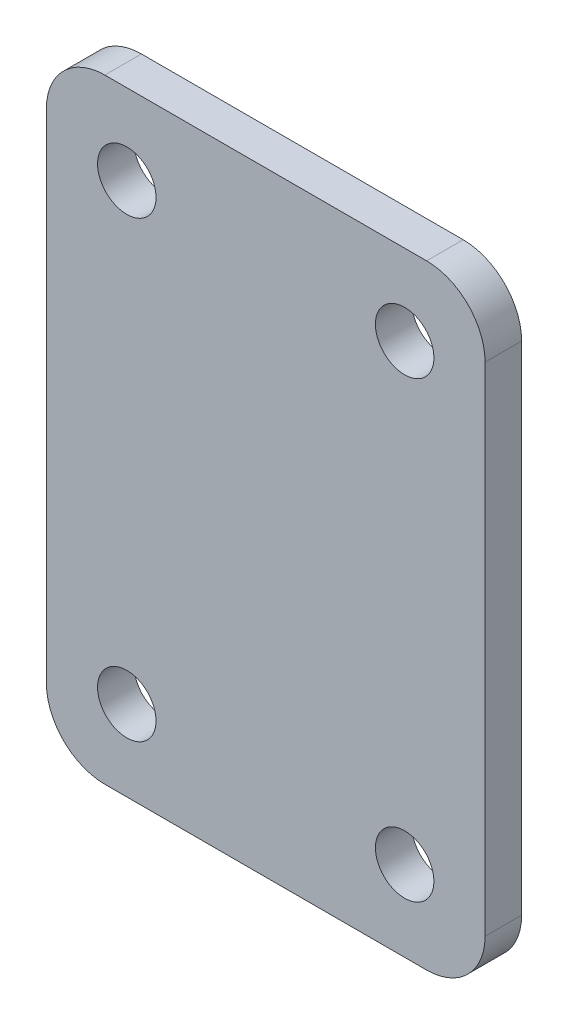
ISO-10303-21;
HEADER;
FILE_DESCRIPTION(('STEP AP214'),'2;1');
FILE_NAME('part.step','',(''),(''),'','','');
FILE_SCHEMA(('AUTOMOTIVE_DESIGN { 1 0 10303 214 1 1 1 1 }'));
ENDSEC;
DATA;
#1=APPLICATION_CONTEXT('core data for automotive mechanical design processes');
#2=APPLICATION_PROTOCOL_DEFINITION('international standard','automotive_design',2000,#1);
#3=PRODUCT_CONTEXT('',#1,'mechanical');
#4=PRODUCT('Part','Part','',(#3));
#5=PRODUCT_RELATED_PRODUCT_CATEGORY('part','',(#4));
#6=PRODUCT_DEFINITION_FORMATION('','',#4);
#7=PRODUCT_DEFINITION_CONTEXT('part definition',#1,'design');
#8=PRODUCT_DEFINITION('design','',#6,#7);
#9=PRODUCT_DEFINITION_SHAPE('','',#8);
#10=(LENGTH_UNIT() NAMED_UNIT(*) SI_UNIT(.MILLI.,.METRE.));
#11=(NAMED_UNIT(*) PLANE_ANGLE_UNIT() SI_UNIT($,.RADIAN.));
#12=(NAMED_UNIT(*) SI_UNIT($,.STERADIAN.) SOLID_ANGLE_UNIT());
#13=UNCERTAINTY_MEASURE_WITH_UNIT(LENGTH_MEASURE(1.E-05),#10,'distance_accuracy_value','');
#14=(GEOMETRIC_REPRESENTATION_CONTEXT(3) GLOBAL_UNCERTAINTY_ASSIGNED_CONTEXT((#13)) GLOBAL_UNIT_ASSIGNED_CONTEXT((#10,
#11,#12)) REPRESENTATION_CONTEXT('',''));
#15=CARTESIAN_POINT('',(0.,0.,0.));
#16=DIRECTION('',(0.,0.,1.));
#17=DIRECTION('',(1.,0.,0.));
#18=AXIS2_PLACEMENT_3D('',#15,#16,#17);
#19=CARTESIAN_POINT('',(71.,-17.,4.88125));
#20=DIRECTION('',(0.,0.,-1.));
#21=DIRECTION('',(-1.,0.,0.));
#22=AXIS2_PLACEMENT_3D('',#19,#20,#21);
#23=PLANE('',#22);
#24=CARTESIAN_POINT('',(71.,-17.,4.88125));
#25=DIRECTION('',(0.,0.,1.));
#26=DIRECTION('',(-1.,0.,0.));
#27=AXIS2_PLACEMENT_3D('',#24,#25,#26);
#28=CIRCLE('',#27,4.);
#29=CARTESIAN_POINT('',(71.,-21.,4.88125));
#30=VERTEX_POINT('',#29);
#31=CARTESIAN_POINT('',(75.,-17.,4.88125));
#32=VERTEX_POINT('',#31);
#33=EDGE_CURVE('E152',#30,#32,#28,.T.);
#34=ORIENTED_EDGE('',*,*,#33,.T.);
#35=DIRECTION('',(0.,1.,0.));
#36=VECTOR('',#35,1.);
#37=CARTESIAN_POINT('',(75.,17.,4.88125));
#38=LINE('',#37,#36);
#39=CARTESIAN_POINT('',(75.,17.,4.88125));
#40=VERTEX_POINT('',#39);
#41=EDGE_CURVE('E100',#32,#40,#38,.T.);
#42=ORIENTED_EDGE('',*,*,#41,.T.);
#43=CARTESIAN_POINT('',(71.,17.,4.88125));
#44=DIRECTION('',(0.,0.,1.));
#45=DIRECTION('',(1.,0.,0.));
#46=AXIS2_PLACEMENT_3D('',#43,#44,#45);
#47=CIRCLE('',#46,4.);
#48=CARTESIAN_POINT('',(71.,21.,4.88125));
#49=VERTEX_POINT('',#48);
#50=EDGE_CURVE('E167',#40,#49,#47,.T.);
#51=ORIENTED_EDGE('',*,*,#50,.T.);
#52=DIRECTION('',(-1.,0.,0.));
#53=VECTOR('',#52,1.);
#54=CARTESIAN_POINT('',(49.,21.,4.88125));
#55=LINE('',#54,#53);
#56=CARTESIAN_POINT('',(49.,21.,4.88125));
#57=VERTEX_POINT('',#56);
#58=EDGE_CURVE('E180',#49,#57,#55,.T.);
#59=ORIENTED_EDGE('',*,*,#58,.T.);
#60=CARTESIAN_POINT('',(49.,17.,4.88125));
#61=DIRECTION('',(0.,0.,1.));
#62=DIRECTION('',(1.,0.,0.));
#63=AXIS2_PLACEMENT_3D('',#60,#61,#62);
#64=CIRCLE('',#63,4.);
#65=CARTESIAN_POINT('',(45.,17.,4.88125));
#66=VERTEX_POINT('',#65);
#67=EDGE_CURVE('E119',#57,#66,#64,.T.);
#68=ORIENTED_EDGE('',*,*,#67,.T.);
#69=DIRECTION('',(0.,-1.,0.));
#70=VECTOR('',#69,1.);
#71=CARTESIAN_POINT('',(45.,17.,4.88125));
#72=LINE('',#71,#70);
#73=CARTESIAN_POINT('',(45.,-17.,4.88125));
#74=VERTEX_POINT('',#73);
#75=EDGE_CURVE('E113',#66,#74,#72,.T.);
#76=ORIENTED_EDGE('',*,*,#75,.T.);
#77=CARTESIAN_POINT('',(49.,-17.,4.88125));
#78=DIRECTION('',(0.,0.,1.));
#79=DIRECTION('',(-1.,0.,0.));
#80=AXIS2_PLACEMENT_3D('',#77,#78,#79);
#81=CIRCLE('',#80,4.);
#82=CARTESIAN_POINT('',(49.,-21.,4.88125));
#83=VERTEX_POINT('',#82);
#84=EDGE_CURVE('E117',#74,#83,#81,.T.);
#85=ORIENTED_EDGE('',*,*,#84,.T.);
#86=DIRECTION('',(1.,0.,0.));
#87=VECTOR('',#86,1.);
#88=CARTESIAN_POINT('',(49.,-21.,4.88125));
#89=LINE('',#88,#87);
#90=EDGE_CURVE('E57',#83,#30,#89,.T.);
#91=ORIENTED_EDGE('',*,*,#90,.T.);
#92=EDGE_LOOP('',(#34,#42,#51,#59,#68,#76,#85,#91));
#93=FACE_BOUND('',#92,.T.);
#94=CARTESIAN_POINT('',(50.5,15.5,4.88125));
#95=DIRECTION('',(0.,0.,1.));
#96=DIRECTION('',(1.,0.,0.));
#97=AXIS2_PLACEMENT_3D('',#94,#95,#96);
#98=CIRCLE('',#97,2.);
#99=CARTESIAN_POINT('',(52.5,15.5,4.88125));
#100=VERTEX_POINT('',#99);
#101=EDGE_CURVE('E141',#100,#100,#98,.T.);
#102=ORIENTED_EDGE('',*,*,#101,.F.);
#103=EDGE_LOOP('',(#102));
#104=FACE_BOUND('',#103,.T.);
#105=CARTESIAN_POINT('',(69.5,15.5,4.88125));
#106=DIRECTION('',(0.,0.,1.));
#107=DIRECTION('',(-1.,0.,0.));
#108=AXIS2_PLACEMENT_3D('',#105,#106,#107);
#109=CIRCLE('',#108,2.00000000000001);
#110=CARTESIAN_POINT('',(67.5,15.5,4.88125));
#111=VERTEX_POINT('',#110);
#112=EDGE_CURVE('E189',#111,#111,#109,.T.);
#113=ORIENTED_EDGE('',*,*,#112,.F.);
#114=EDGE_LOOP('',(#113));
#115=FACE_BOUND('',#114,.T.);
#116=CARTESIAN_POINT('',(69.5,-15.5,4.88125));
#117=DIRECTION('',(0.,0.,1.));
#118=DIRECTION('',(1.,0.,0.));
#119=AXIS2_PLACEMENT_3D('',#116,#117,#118);
#120=CIRCLE('',#119,2.00000000000001);
#121=CARTESIAN_POINT('',(71.5,-15.5,4.88125));
#122=VERTEX_POINT('',#121);
#123=EDGE_CURVE('E195',#122,#122,#120,.T.);
#124=ORIENTED_EDGE('',*,*,#123,.F.);
#125=EDGE_LOOP('',(#124));
#126=FACE_BOUND('',#125,.T.);
#127=CARTESIAN_POINT('',(50.5,-15.5,4.88125));
#128=DIRECTION('',(0.,0.,1.));
#129=DIRECTION('',(-1.,0.,0.));
#130=AXIS2_PLACEMENT_3D('',#127,#128,#129);
#131=CIRCLE('',#130,2.);
#132=CARTESIAN_POINT('',(48.5,-15.5,4.88125));
#133=VERTEX_POINT('',#132);
#134=EDGE_CURVE('E201',#133,#133,#131,.T.);
#135=ORIENTED_EDGE('',*,*,#134,.F.);
#136=EDGE_LOOP('',(#135));
#137=FACE_BOUND('',#136,.T.);
#138=ADVANCED_FACE('F40',(#93,#104,#115,#126,#137),#23,.F.);
#139=CARTESIAN_POINT('',(71.,-17.,2.38125));
#140=DIRECTION('',(0.,0.,-1.));
#141=DIRECTION('',(-1.,0.,0.));
#142=AXIS2_PLACEMENT_3D('',#139,#140,#141);
#143=PLANE('',#142);
#144=CARTESIAN_POINT('',(69.5,-15.5,2.38125));
#145=DIRECTION('',(0.,0.,1.));
#146=DIRECTION('',(1.,0.,0.));
#147=AXIS2_PLACEMENT_3D('',#144,#145,#146);
#148=CIRCLE('',#147,2.00000000000001);
#149=CARTESIAN_POINT('',(71.5,-15.5,2.38125));
#150=VERTEX_POINT('',#149);
#151=EDGE_CURVE('E198',#150,#150,#148,.T.);
#152=ORIENTED_EDGE('',*,*,#151,.T.);
#153=EDGE_LOOP('',(#152));
#154=FACE_BOUND('',#153,.T.);
#155=CARTESIAN_POINT('',(50.5,15.5,2.38125));
#156=DIRECTION('',(0.,0.,1.));
#157=DIRECTION('',(1.,0.,0.));
#158=AXIS2_PLACEMENT_3D('',#155,#156,#157);
#159=CIRCLE('',#158,2.);
#160=CARTESIAN_POINT('',(52.5,15.5,2.38125));
#161=VERTEX_POINT('',#160);
#162=EDGE_CURVE('E186',#161,#161,#159,.T.);
#163=ORIENTED_EDGE('',*,*,#162,.T.);
#164=EDGE_LOOP('',(#163));
#165=FACE_BOUND('',#164,.T.);
#166=CARTESIAN_POINT('',(71.,-17.,2.38125));
#167=DIRECTION('',(0.,0.,1.));
#168=DIRECTION('',(-1.,0.,0.));
#169=AXIS2_PLACEMENT_3D('',#166,#167,#168);
#170=CIRCLE('',#169,4.);
#171=CARTESIAN_POINT('',(71.,-21.,2.38125));
#172=VERTEX_POINT('',#171);
#173=CARTESIAN_POINT('',(75.,-17.,2.38125));
#174=VERTEX_POINT('',#173);
#175=EDGE_CURVE('E137',#172,#174,#170,.T.);
#176=ORIENTED_EDGE('',*,*,#175,.F.);
#177=DIRECTION('',(1.,0.,0.));
#178=VECTOR('',#177,1.);
#179=CARTESIAN_POINT('',(49.,-21.,2.38125));
#180=LINE('',#179,#178);
#181=CARTESIAN_POINT('',(49.,-21.,2.38125));
#182=VERTEX_POINT('',#181);
#183=EDGE_CURVE('E92',#182,#172,#180,.T.);
#184=ORIENTED_EDGE('',*,*,#183,.F.);
#185=CARTESIAN_POINT('',(49.,-17.,2.38125));
#186=DIRECTION('',(0.,0.,1.));
#187=DIRECTION('',(-1.,0.,0.));
#188=AXIS2_PLACEMENT_3D('',#185,#186,#187);
#189=CIRCLE('',#188,4.);
#190=CARTESIAN_POINT('',(45.,-17.,2.38125));
#191=VERTEX_POINT('',#190);
#192=EDGE_CURVE('E86',#191,#182,#189,.T.);
#193=ORIENTED_EDGE('',*,*,#192,.F.);
#194=DIRECTION('',(0.,-1.,0.));
#195=VECTOR('',#194,1.);
#196=CARTESIAN_POINT('',(45.,17.,2.38125));
#197=LINE('',#196,#195);
#198=CARTESIAN_POINT('',(45.,17.,2.38125));
#199=VERTEX_POINT('',#198);
#200=EDGE_CURVE('E127',#199,#191,#197,.T.);
#201=ORIENTED_EDGE('',*,*,#200,.F.);
#202=CARTESIAN_POINT('',(49.,17.,2.38125));
#203=DIRECTION('',(0.,0.,1.));
#204=DIRECTION('',(1.,0.,0.));
#205=AXIS2_PLACEMENT_3D('',#202,#203,#204);
#206=CIRCLE('',#205,4.);
#207=CARTESIAN_POINT('',(49.,21.,2.38125));
#208=VERTEX_POINT('',#207);
#209=EDGE_CURVE('E147',#208,#199,#206,.T.);
#210=ORIENTED_EDGE('',*,*,#209,.F.);
#211=DIRECTION('',(-1.,0.,0.));
#212=VECTOR('',#211,1.);
#213=CARTESIAN_POINT('',(49.,21.,2.38125));
#214=LINE('',#213,#212);
#215=CARTESIAN_POINT('',(71.,21.,2.38125));
#216=VERTEX_POINT('',#215);
#217=EDGE_CURVE('E145',#216,#208,#214,.T.);
#218=ORIENTED_EDGE('',*,*,#217,.F.);
#219=CARTESIAN_POINT('',(71.,17.,2.38125));
#220=DIRECTION('',(0.,0.,1.));
#221=DIRECTION('',(1.,0.,0.));
#222=AXIS2_PLACEMENT_3D('',#219,#220,#221);
#223=CIRCLE('',#222,4.);
#224=CARTESIAN_POINT('',(75.,17.,2.38125));
#225=VERTEX_POINT('',#224);
#226=EDGE_CURVE('E143',#225,#216,#223,.T.);
#227=ORIENTED_EDGE('',*,*,#226,.F.);
#228=DIRECTION('',(0.,1.,0.));
#229=VECTOR('',#228,1.);
#230=CARTESIAN_POINT('',(75.,17.,2.38125));
#231=LINE('',#230,#229);
#232=EDGE_CURVE('E140',#174,#225,#231,.T.);
#233=ORIENTED_EDGE('',*,*,#232,.F.);
#234=EDGE_LOOP('',(#176,#184,#193,#201,#210,#218,#227,#233));
#235=FACE_BOUND('',#234,.T.);
#236=CARTESIAN_POINT('',(69.5,15.5,2.38125));
#237=DIRECTION('',(0.,0.,1.));
#238=DIRECTION('',(-1.,0.,0.));
#239=AXIS2_PLACEMENT_3D('',#236,#237,#238);
#240=CIRCLE('',#239,2.00000000000001);
#241=CARTESIAN_POINT('',(67.5,15.5,2.38125));
#242=VERTEX_POINT('',#241);
#243=EDGE_CURVE('E192',#242,#242,#240,.T.);
#244=ORIENTED_EDGE('',*,*,#243,.T.);
#245=EDGE_LOOP('',(#244));
#246=FACE_BOUND('',#245,.T.);
#247=CARTESIAN_POINT('',(50.5,-15.5,2.38125));
#248=DIRECTION('',(0.,0.,1.));
#249=DIRECTION('',(-1.,0.,0.));
#250=AXIS2_PLACEMENT_3D('',#247,#248,#249);
#251=CIRCLE('',#250,2.);
#252=CARTESIAN_POINT('',(48.5,-15.5,2.38125));
#253=VERTEX_POINT('',#252);
#254=EDGE_CURVE('E204',#253,#253,#251,.T.);
#255=ORIENTED_EDGE('',*,*,#254,.T.);
#256=EDGE_LOOP('',(#255));
#257=FACE_BOUND('',#256,.T.);
#258=ADVANCED_FACE('F171',(#154,#165,#235,#246,#257),#143,.T.);
#259=CARTESIAN_POINT('',(71.,-17.,4.88125));
#260=DIRECTION('',(0.,0.,-1.));
#261=DIRECTION('',(-1.,0.,0.));
#262=AXIS2_PLACEMENT_3D('',#259,#260,#261);
#263=CYLINDRICAL_SURFACE('',#262,4.);
#264=ORIENTED_EDGE('',*,*,#175,.T.);
#265=DIRECTION('',(0.,0.,-1.));
#266=VECTOR('',#265,1.);
#267=CARTESIAN_POINT('',(75.,-17.,4.88125));
#268=LINE('',#267,#266);
#269=EDGE_CURVE('E11',#32,#174,#268,.T.);
#270=ORIENTED_EDGE('',*,*,#269,.F.);
#271=ORIENTED_EDGE('',*,*,#33,.F.);
#272=DIRECTION('',(0.,0.,-1.));
#273=VECTOR('',#272,1.);
#274=CARTESIAN_POINT('',(71.,-21.,4.88125));
#275=LINE('',#274,#273);
#276=EDGE_CURVE('E133',#30,#172,#275,.T.);
#277=ORIENTED_EDGE('',*,*,#276,.T.);
#278=EDGE_LOOP('',(#264,#270,#271,#277));
#279=FACE_BOUND('',#278,.T.);
#280=ADVANCED_FACE('F42',(#279),#263,.T.);
#281=CARTESIAN_POINT('',(75.,17.,4.88125));
#282=DIRECTION('',(-1.,0.,0.));
#283=DIRECTION('',(0.,0.,1.));
#284=AXIS2_PLACEMENT_3D('',#281,#282,#283);
#285=PLANE('',#284);
#286=ORIENTED_EDGE('',*,*,#232,.T.);
#287=DIRECTION('',(0.,0.,-1.));
#288=VECTOR('',#287,1.);
#289=CARTESIAN_POINT('',(75.,17.,4.88125));
#290=LINE('',#289,#288);
#291=EDGE_CURVE('E49',#40,#225,#290,.T.);
#292=ORIENTED_EDGE('',*,*,#291,.F.);
#293=ORIENTED_EDGE('',*,*,#41,.F.);
#294=ORIENTED_EDGE('',*,*,#269,.T.);
#295=EDGE_LOOP('',(#286,#292,#293,#294));
#296=FACE_BOUND('',#295,.T.);
#297=ADVANCED_FACE('F236',(#296),#285,.F.);
#298=CARTESIAN_POINT('',(71.,17.,4.88125));
#299=DIRECTION('',(0.,0.,-1.));
#300=DIRECTION('',(-1.,0.,0.));
#301=AXIS2_PLACEMENT_3D('',#298,#299,#300);
#302=CYLINDRICAL_SURFACE('',#301,4.);
#303=ORIENTED_EDGE('',*,*,#226,.T.);
#304=DIRECTION('',(0.,0.,-1.));
#305=VECTOR('',#304,1.);
#306=CARTESIAN_POINT('',(71.,21.,4.88125));
#307=LINE('',#306,#305);
#308=EDGE_CURVE('E159',#49,#216,#307,.T.);
#309=ORIENTED_EDGE('',*,*,#308,.F.);
#310=ORIENTED_EDGE('',*,*,#50,.F.);
#311=ORIENTED_EDGE('',*,*,#291,.T.);
#312=EDGE_LOOP('',(#303,#309,#310,#311));
#313=FACE_BOUND('',#312,.T.);
#314=ADVANCED_FACE('F165',(#313),#302,.T.);
#315=CARTESIAN_POINT('',(49.,21.,4.88125));
#316=DIRECTION('',(0.,-1.,0.));
#317=DIRECTION('',(0.,0.,-1.));
#318=AXIS2_PLACEMENT_3D('',#315,#316,#317);
#319=PLANE('',#318);
#320=ORIENTED_EDGE('',*,*,#217,.T.);
#321=DIRECTION('',(0.,0.,-1.));
#322=VECTOR('',#321,1.);
#323=CARTESIAN_POINT('',(49.,21.,4.88125));
#324=LINE('',#323,#322);
#325=EDGE_CURVE('E156',#57,#208,#324,.T.);
#326=ORIENTED_EDGE('',*,*,#325,.F.);
#327=ORIENTED_EDGE('',*,*,#58,.F.);
#328=ORIENTED_EDGE('',*,*,#308,.T.);
#329=EDGE_LOOP('',(#320,#326,#327,#328));
#330=FACE_BOUND('',#329,.T.);
#331=ADVANCED_FACE('F176',(#330),#319,.F.);
#332=CARTESIAN_POINT('',(49.,17.,4.88125));
#333=DIRECTION('',(0.,0.,-1.));
#334=DIRECTION('',(-1.,0.,0.));
#335=AXIS2_PLACEMENT_3D('',#332,#333,#334);
#336=CYLINDRICAL_SURFACE('',#335,4.);
#337=ORIENTED_EDGE('',*,*,#209,.T.);
#338=DIRECTION('',(0.,0.,-1.));
#339=VECTOR('',#338,1.);
#340=CARTESIAN_POINT('',(45.,17.,4.88125));
#341=LINE('',#340,#339);
#342=EDGE_CURVE('E128',#66,#199,#341,.T.);
#343=ORIENTED_EDGE('',*,*,#342,.F.);
#344=ORIENTED_EDGE('',*,*,#67,.F.);
#345=ORIENTED_EDGE('',*,*,#325,.T.);
#346=EDGE_LOOP('',(#337,#343,#344,#345));
#347=FACE_BOUND('',#346,.T.);
#348=ADVANCED_FACE('F179',(#347),#336,.T.);
#349=CARTESIAN_POINT('',(45.,17.,4.88125));
#350=DIRECTION('',(1.,0.,0.));
#351=DIRECTION('',(0.,0.,-1.));
#352=AXIS2_PLACEMENT_3D('',#349,#350,#351);
#353=PLANE('',#352);
#354=ORIENTED_EDGE('',*,*,#200,.T.);
#355=DIRECTION('',(0.,0.,-1.));
#356=VECTOR('',#355,1.);
#357=CARTESIAN_POINT('',(45.,-17.,4.88125));
#358=LINE('',#357,#356);
#359=EDGE_CURVE('E124',#74,#191,#358,.T.);
#360=ORIENTED_EDGE('',*,*,#359,.F.);
#361=ORIENTED_EDGE('',*,*,#75,.F.);
#362=ORIENTED_EDGE('',*,*,#342,.T.);
#363=EDGE_LOOP('',(#354,#360,#361,#362));
#364=FACE_BOUND('',#363,.T.);
#365=ADVANCED_FACE('F125',(#364),#353,.F.);
#366=CARTESIAN_POINT('',(49.,-17.,4.88125));
#367=DIRECTION('',(0.,0.,-1.));
#368=DIRECTION('',(-1.,0.,0.));
#369=AXIS2_PLACEMENT_3D('',#366,#367,#368);
#370=CYLINDRICAL_SURFACE('',#369,4.);
#371=ORIENTED_EDGE('',*,*,#192,.T.);
#372=DIRECTION('',(0.,0.,-1.));
#373=VECTOR('',#372,1.);
#374=CARTESIAN_POINT('',(49.,-21.,4.88125));
#375=LINE('',#374,#373);
#376=EDGE_CURVE('E129',#83,#182,#375,.T.);
#377=ORIENTED_EDGE('',*,*,#376,.F.);
#378=ORIENTED_EDGE('',*,*,#84,.F.);
#379=ORIENTED_EDGE('',*,*,#359,.T.);
#380=EDGE_LOOP('',(#371,#377,#378,#379));
#381=FACE_BOUND('',#380,.T.);
#382=ADVANCED_FACE('F131',(#381),#370,.T.);
#383=CARTESIAN_POINT('',(49.,-21.,4.88125));
#384=DIRECTION('',(0.,1.,0.));
#385=DIRECTION('',(0.,0.,1.));
#386=AXIS2_PLACEMENT_3D('',#383,#384,#385);
#387=PLANE('',#386);
#388=ORIENTED_EDGE('',*,*,#183,.T.);
#389=ORIENTED_EDGE('',*,*,#276,.F.);
#390=ORIENTED_EDGE('',*,*,#90,.F.);
#391=ORIENTED_EDGE('',*,*,#376,.T.);
#392=EDGE_LOOP('',(#388,#389,#390,#391));
#393=FACE_BOUND('',#392,.T.);
#394=ADVANCED_FACE('F224',(#393),#387,.F.);
#395=CARTESIAN_POINT('',(50.5,15.5,4.88125));
#396=DIRECTION('',(0.,0.,-1.));
#397=DIRECTION('',(-1.,0.,0.));
#398=AXIS2_PLACEMENT_3D('',#395,#396,#397);
#399=CYLINDRICAL_SURFACE('',#398,2.);
#400=ORIENTED_EDGE('',*,*,#101,.T.);
#401=EDGE_LOOP('',(#400));
#402=FACE_BOUND('',#401,.T.);
#403=ORIENTED_EDGE('',*,*,#162,.F.);
#404=EDGE_LOOP('',(#403));
#405=FACE_BOUND('',#404,.T.);
#406=ADVANCED_FACE('F221',(#402,#405),#399,.F.);
#407=CARTESIAN_POINT('',(69.5,15.5,4.88125));
#408=DIRECTION('',(0.,0.,-1.));
#409=DIRECTION('',(-1.,0.,0.));
#410=AXIS2_PLACEMENT_3D('',#407,#408,#409);
#411=CYLINDRICAL_SURFACE('',#410,2.00000000000001);
#412=ORIENTED_EDGE('',*,*,#112,.T.);
#413=EDGE_LOOP('',(#412));
#414=FACE_BOUND('',#413,.T.);
#415=ORIENTED_EDGE('',*,*,#243,.F.);
#416=EDGE_LOOP('',(#415));
#417=FACE_BOUND('',#416,.T.);
#418=ADVANCED_FACE('F299',(#414,#417),#411,.F.);
#419=CARTESIAN_POINT('',(69.5,-15.5,4.88125));
#420=DIRECTION('',(0.,0.,-1.));
#421=DIRECTION('',(-1.,0.,0.));
#422=AXIS2_PLACEMENT_3D('',#419,#420,#421);
#423=CYLINDRICAL_SURFACE('',#422,2.00000000000001);
#424=ORIENTED_EDGE('',*,*,#123,.T.);
#425=EDGE_LOOP('',(#424));
#426=FACE_BOUND('',#425,.T.);
#427=ORIENTED_EDGE('',*,*,#151,.F.);
#428=EDGE_LOOP('',(#427));
#429=FACE_BOUND('',#428,.T.);
#430=ADVANCED_FACE('F307',(#426,#429),#423,.F.);
#431=CARTESIAN_POINT('',(50.5,-15.5,4.88125));
#432=DIRECTION('',(0.,0.,-1.));
#433=DIRECTION('',(-1.,0.,0.));
#434=AXIS2_PLACEMENT_3D('',#431,#432,#433);
#435=CYLINDRICAL_SURFACE('',#434,2.);
#436=ORIENTED_EDGE('',*,*,#134,.T.);
#437=EDGE_LOOP('',(#436));
#438=FACE_BOUND('',#437,.T.);
#439=ORIENTED_EDGE('',*,*,#254,.F.);
#440=EDGE_LOOP('',(#439));
#441=FACE_BOUND('',#440,.T.);
#442=ADVANCED_FACE('F210',(#438,#441),#435,.F.);
#443=CLOSED_SHELL('',(#138,#258,#280,#297,#314,#331,#348,#365,#382,#394,#406,#418,#430,#442));
#444=MANIFOLD_SOLID_BREP('B2',#443);
#445=ADVANCED_BREP_SHAPE_REPRESENTATION('',(#18,#444),#14);
#446=SHAPE_DEFINITION_REPRESENTATION(#9,#445);
ENDSEC;
END-ISO-10303-21;
